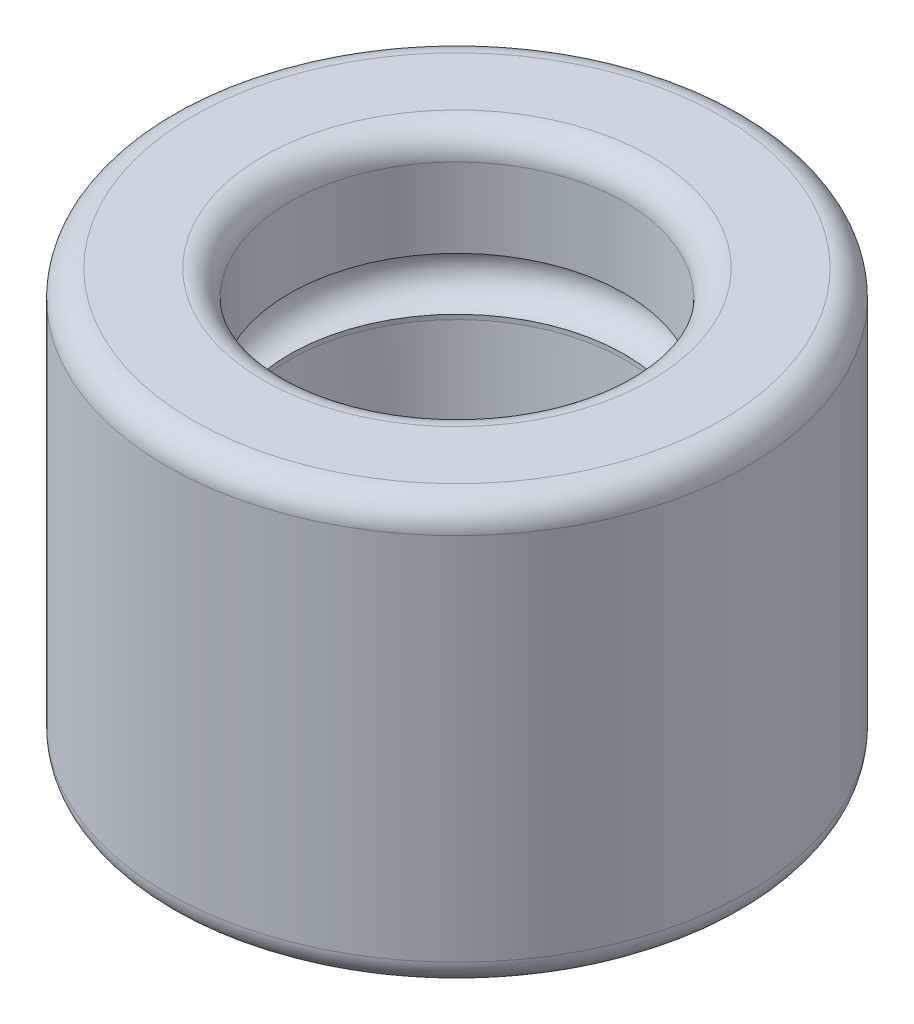
ISO-10303-21;
HEADER;
FILE_DESCRIPTION(('STEP AP214'),'2;1');
FILE_NAME('part.step','',(''),(''),'','','');
FILE_SCHEMA(('AUTOMOTIVE_DESIGN { 1 0 10303 214 1 1 1 1 }'));
ENDSEC;
DATA;
#1=APPLICATION_CONTEXT('core data for automotive mechanical design processes');
#2=APPLICATION_PROTOCOL_DEFINITION('international standard','automotive_design',2000,#1);
#3=PRODUCT_CONTEXT('',#1,'mechanical');
#4=PRODUCT('Part','Part','',(#3));
#5=PRODUCT_RELATED_PRODUCT_CATEGORY('part','',(#4));
#6=PRODUCT_DEFINITION_FORMATION('','',#4);
#7=PRODUCT_DEFINITION_CONTEXT('part definition',#1,'design');
#8=PRODUCT_DEFINITION('design','',#6,#7);
#9=PRODUCT_DEFINITION_SHAPE('','',#8);
#10=(LENGTH_UNIT() NAMED_UNIT(*) SI_UNIT(.MILLI.,.METRE.));
#11=(NAMED_UNIT(*) PLANE_ANGLE_UNIT() SI_UNIT($,.RADIAN.));
#12=(NAMED_UNIT(*) SI_UNIT($,.STERADIAN.) SOLID_ANGLE_UNIT());
#13=UNCERTAINTY_MEASURE_WITH_UNIT(LENGTH_MEASURE(1.E-05),#10,'distance_accuracy_value','');
#14=(GEOMETRIC_REPRESENTATION_CONTEXT(3) GLOBAL_UNCERTAINTY_ASSIGNED_CONTEXT((#13)) GLOBAL_UNIT_ASSIGNED_CONTEXT((#10,
#11,#12)) REPRESENTATION_CONTEXT('',''));
#15=CARTESIAN_POINT('',(0.,0.,0.));
#16=DIRECTION('',(0.,0.,1.));
#17=DIRECTION('',(1.,0.,0.));
#18=AXIS2_PLACEMENT_3D('',#15,#16,#17);
#19=CARTESIAN_POINT('',(-3.175,1.48321934595789,0.));
#20=DIRECTION('',(0.,-1.,0.));
#21=DIRECTION('',(0.,0.,-1.));
#22=AXIS2_PLACEMENT_3D('',#19,#20,#21);
#23=PLANE('',#22);
#24=CARTESIAN_POINT('',(0.,1.48321934595789,0.));
#25=DIRECTION('',(0.,-1.,0.));
#26=DIRECTION('',(0.,0.,-1.));
#27=AXIS2_PLACEMENT_3D('',#24,#25,#26);
#28=CIRCLE('',#27,2.87499999999999);
#29=CARTESIAN_POINT('',(0.,1.48321934595789,-2.87499999999999));
#30=VERTEX_POINT('',#29);
#31=EDGE_CURVE('E73',#30,#30,#28,.F.);
#32=ORIENTED_EDGE('',*,*,#31,.T.);
#33=EDGE_LOOP('',(#32));
#34=FACE_BOUND('',#33,.T.);
#35=ADVANCED_FACE('F41',(#34),#23,.F.);
#36=CARTESIAN_POINT('',(0.,0.,0.));
#37=DIRECTION('',(0.,-1.,0.));
#38=DIRECTION('',(0.,0.,-1.));
#39=AXIS2_PLACEMENT_3D('',#36,#37,#38);
#40=CYLINDRICAL_SURFACE('',#39,3.175);
#41=CARTESIAN_POINT('',(0.,4.91223503678664,0.));
#42=DIRECTION('',(0.,-1.,0.));
#43=DIRECTION('',(0.,0.,-1.));
#44=AXIS2_PLACEMENT_3D('',#41,#42,#43);
#45=CIRCLE('',#44,3.175);
#46=CARTESIAN_POINT('',(0.,4.91223503678664,-3.175));
#47=VERTEX_POINT('',#46);
#48=EDGE_CURVE('E77',#47,#47,#45,.T.);
#49=ORIENTED_EDGE('',*,*,#48,.T.);
#50=EDGE_LOOP('',(#49));
#51=FACE_BOUND('',#50,.T.);
#52=CARTESIAN_POINT('',(0.,5.,0.));
#53=DIRECTION('',(0.,-1.,0.));
#54=DIRECTION('',(0.,0.,-1.));
#55=AXIS2_PLACEMENT_3D('',#52,#53,#54);
#56=CIRCLE('',#55,3.175);
#57=CARTESIAN_POINT('',(0.,5.,-3.175));
#58=VERTEX_POINT('',#57);
#59=EDGE_CURVE('E81',#58,#58,#56,.T.);
#60=ORIENTED_EDGE('',*,*,#59,.F.);
#61=EDGE_LOOP('',(#60));
#62=FACE_BOUND('',#61,.T.);
#63=ADVANCED_FACE('F95',(#51,#62),#40,.F.);
#64=CARTESIAN_POINT('',(0.,5.5,0.));
#65=DIRECTION('',(0.,-1.,0.));
#66=DIRECTION('',(0.,0.,-1.));
#67=AXIS2_PLACEMENT_3D('',#64,#65,#66);
#68=TOROIDAL_SURFACE('',#67,3.175,0.5);
#69=CARTESIAN_POINT('',(0.,6.,0.));
#70=DIRECTION('',(0.,-1.,0.));
#71=DIRECTION('',(0.,0.,-1.));
#72=AXIS2_PLACEMENT_3D('',#69,#70,#71);
#73=CIRCLE('',#72,3.175);
#74=CARTESIAN_POINT('',(0.,6.,-3.175));
#75=VERTEX_POINT('',#74);
#76=EDGE_CURVE('E85',#75,#75,#73,.T.);
#77=ORIENTED_EDGE('',*,*,#76,.F.);
#78=EDGE_LOOP('',(#77));
#79=FACE_BOUND('',#78,.T.);
#80=ORIENTED_EDGE('',*,*,#59,.T.);
#81=EDGE_LOOP('',(#80));
#82=FACE_BOUND('',#81,.T.);
#83=ADVANCED_FACE('F92',(#79,#82),#68,.F.);
#84=CARTESIAN_POINT('',(0.,0.,0.));
#85=DIRECTION('',(0.,-1.,0.));
#86=DIRECTION('',(0.,0.,-1.));
#87=AXIS2_PLACEMENT_3D('',#84,#85,#86);
#88=CYLINDRICAL_SURFACE('',#87,3.175);
#89=CARTESIAN_POINT('',(0.,7.5,0.));
#90=DIRECTION('',(0.,-1.,0.));
#91=DIRECTION('',(0.,0.,-1.));
#92=AXIS2_PLACEMENT_3D('',#89,#90,#91);
#93=CIRCLE('',#92,3.175);
#94=CARTESIAN_POINT('',(0.,7.5,-3.175));
#95=VERTEX_POINT('',#94);
#96=EDGE_CURVE('E10',#95,#95,#93,.F.);
#97=ORIENTED_EDGE('',*,*,#96,.T.);
#98=EDGE_LOOP('',(#97));
#99=FACE_BOUND('',#98,.T.);
#100=ORIENTED_EDGE('',*,*,#76,.T.);
#101=EDGE_LOOP('',(#100));
#102=FACE_BOUND('',#101,.T.);
#103=ADVANCED_FACE('F90',(#99,#102),#88,.F.);
#104=CARTESIAN_POINT('',(-5.5,8.,0.));
#105=DIRECTION('',(0.,-1.,0.));
#106=DIRECTION('',(0.,0.,-1.));
#107=AXIS2_PLACEMENT_3D('',#104,#105,#106);
#108=PLANE('',#107);
#109=CARTESIAN_POINT('',(0.,8.,0.));
#110=DIRECTION('',(0.,-1.,0.));
#111=DIRECTION('',(0.,0.,-1.));
#112=AXIS2_PLACEMENT_3D('',#109,#110,#111);
#113=CIRCLE('',#112,3.675);
#114=CARTESIAN_POINT('',(0.,8.,-3.675));
#115=VERTEX_POINT('',#114);
#116=EDGE_CURVE('E49',#115,#115,#113,.T.);
#117=ORIENTED_EDGE('',*,*,#116,.T.);
#118=EDGE_LOOP('',(#117));
#119=FACE_BOUND('',#118,.T.);
#120=CARTESIAN_POINT('',(0.,8.,0.));
#121=DIRECTION('',(0.,-1.,0.));
#122=DIRECTION('',(0.,0.,-1.));
#123=AXIS2_PLACEMENT_3D('',#120,#121,#122);
#124=CIRCLE('',#123,5.);
#125=CARTESIAN_POINT('',(0.,8.,-5.));
#126=VERTEX_POINT('',#125);
#127=EDGE_CURVE('E54',#126,#126,#124,.F.);
#128=ORIENTED_EDGE('',*,*,#127,.T.);
#129=EDGE_LOOP('',(#128));
#130=FACE_BOUND('',#129,.T.);
#131=ADVANCED_FACE('F136',(#119,#130),#108,.F.);
#132=CARTESIAN_POINT('',(0.,0.,0.));
#133=DIRECTION('',(0.,-1.,0.));
#134=DIRECTION('',(0.,0.,-1.));
#135=AXIS2_PLACEMENT_3D('',#132,#133,#134);
#136=CYLINDRICAL_SURFACE('',#135,5.5);
#137=CARTESIAN_POINT('',(0.,0.5,0.));
#138=DIRECTION('',(0.,1.,0.));
#139=DIRECTION('',(0.,0.,1.));
#140=AXIS2_PLACEMENT_3D('',#137,#138,#139);
#141=CIRCLE('',#140,5.5);
#142=CARTESIAN_POINT('',(0.,0.5,5.5));
#143=VERTEX_POINT('',#142);
#144=EDGE_CURVE('E59',#143,#143,#141,.T.);
#145=ORIENTED_EDGE('',*,*,#144,.T.);
#146=EDGE_LOOP('',(#145));
#147=FACE_BOUND('',#146,.T.);
#148=CARTESIAN_POINT('',(0.,7.5,0.));
#149=DIRECTION('',(0.,-1.,0.));
#150=DIRECTION('',(0.,0.,-1.));
#151=AXIS2_PLACEMENT_3D('',#148,#149,#150);
#152=CIRCLE('',#151,5.5);
#153=CARTESIAN_POINT('',(0.,7.5,-5.5));
#154=VERTEX_POINT('',#153);
#155=EDGE_CURVE('E65',#154,#154,#152,.T.);
#156=ORIENTED_EDGE('',*,*,#155,.T.);
#157=EDGE_LOOP('',(#156));
#158=FACE_BOUND('',#157,.T.);
#159=ADVANCED_FACE('F134',(#147,#158),#136,.T.);
#160=CARTESIAN_POINT('',(0.,0.,0.));
#161=DIRECTION('',(0.,1.,0.));
#162=DIRECTION('',(0.,0.,1.));
#163=AXIS2_PLACEMENT_3D('',#160,#161,#162);
#164=PLANE('',#163);
#165=CARTESIAN_POINT('',(0.,0.,0.));
#166=DIRECTION('',(0.,1.,0.));
#167=DIRECTION('',(0.,0.,1.));
#168=AXIS2_PLACEMENT_3D('',#165,#166,#167);
#169=CIRCLE('',#168,5.);
#170=CARTESIAN_POINT('',(0.,0.,5.));
#171=VERTEX_POINT('',#170);
#172=EDGE_CURVE('E69',#171,#171,#169,.F.);
#173=ORIENTED_EDGE('',*,*,#172,.T.);
#174=EDGE_LOOP('',(#173));
#175=FACE_BOUND('',#174,.T.);
#176=ADVANCED_FACE('F116',(#175),#164,.F.);
#177=CARTESIAN_POINT('',(0.,4.91223503678664,0.));
#178=DIRECTION('',(0.,1.,0.));
#179=DIRECTION('',(0.,0.,1.));
#180=AXIS2_PLACEMENT_3D('',#177,#178,#179);
#181=CONICAL_SURFACE('',#180,3.175,0.0872664625997102);
#182=ORIENTED_EDGE('',*,*,#31,.F.);
#183=EDGE_LOOP('',(#182));
#184=FACE_BOUND('',#183,.T.);
#185=ORIENTED_EDGE('',*,*,#48,.F.);
#186=EDGE_LOOP('',(#185));
#187=FACE_BOUND('',#186,.T.);
#188=ADVANCED_FACE('F110',(#184,#187),#181,.F.);
#189=CARTESIAN_POINT('',(0.,0.5,0.));
#190=DIRECTION('',(0.,1.,0.));
#191=DIRECTION('',(0.,0.,1.));
#192=AXIS2_PLACEMENT_3D('',#189,#190,#191);
#193=TOROIDAL_SURFACE('',#192,5.,0.5);
#194=ORIENTED_EDGE('',*,*,#144,.F.);
#195=EDGE_LOOP('',(#194));
#196=FACE_BOUND('',#195,.T.);
#197=ORIENTED_EDGE('',*,*,#172,.F.);
#198=EDGE_LOOP('',(#197));
#199=FACE_BOUND('',#198,.T.);
#200=ADVANCED_FACE('F115',(#196,#199),#193,.T.);
#201=CARTESIAN_POINT('',(0.,7.5,0.));
#202=DIRECTION('',(0.,-1.,0.));
#203=DIRECTION('',(0.,0.,-1.));
#204=AXIS2_PLACEMENT_3D('',#201,#202,#203);
#205=TOROIDAL_SURFACE('',#204,3.675,0.5);
#206=ORIENTED_EDGE('',*,*,#96,.F.);
#207=EDGE_LOOP('',(#206));
#208=FACE_BOUND('',#207,.T.);
#209=ORIENTED_EDGE('',*,*,#116,.F.);
#210=EDGE_LOOP('',(#209));
#211=FACE_BOUND('',#210,.T.);
#212=ADVANCED_FACE('F119',(#208,#211),#205,.T.);
#213=CARTESIAN_POINT('',(0.,7.5,0.));
#214=DIRECTION('',(0.,-1.,0.));
#215=DIRECTION('',(0.,0.,-1.));
#216=AXIS2_PLACEMENT_3D('',#213,#214,#215);
#217=TOROIDAL_SURFACE('',#216,5.,0.5);
#218=ORIENTED_EDGE('',*,*,#127,.F.);
#219=EDGE_LOOP('',(#218));
#220=FACE_BOUND('',#219,.T.);
#221=ORIENTED_EDGE('',*,*,#155,.F.);
#222=EDGE_LOOP('',(#221));
#223=FACE_BOUND('',#222,.T.);
#224=ADVANCED_FACE('F43',(#220,#223),#217,.T.);
#225=CLOSED_SHELL('',(#35,#63,#83,#103,#131,#159,#176,#188,#200,#212,#224));
#226=MANIFOLD_SOLID_BREP('B2',#225);
#227=ADVANCED_BREP_SHAPE_REPRESENTATION('',(#18,#226),#14);
#228=SHAPE_DEFINITION_REPRESENTATION(#9,#227);
ENDSEC;
END-ISO-10303-21;
